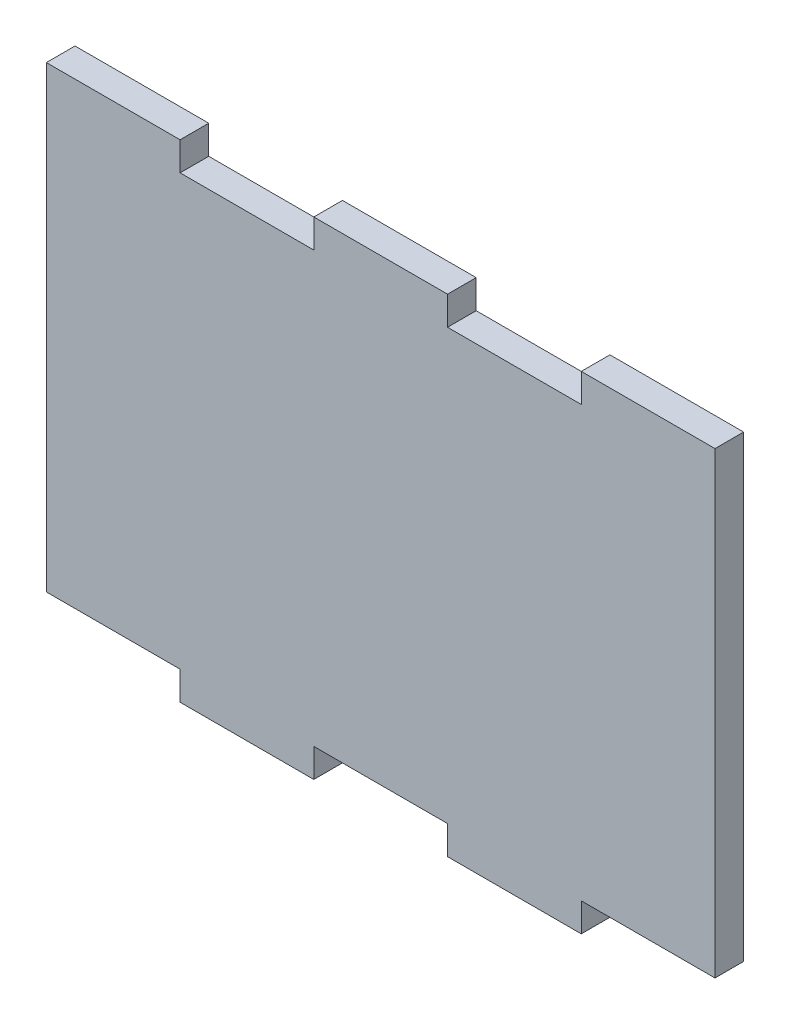
ISO-10303-21;
HEADER;
FILE_DESCRIPTION(('STEP AP214'),'2;1');
FILE_NAME('part.step','',(''),(''),'','','');
FILE_SCHEMA(('AUTOMOTIVE_DESIGN { 1 0 10303 214 1 1 1 1 }'));
ENDSEC;
DATA;
#1=APPLICATION_CONTEXT('core data for automotive mechanical design processes');
#2=APPLICATION_PROTOCOL_DEFINITION('international standard','automotive_design',2000,#1);
#3=PRODUCT_CONTEXT('',#1,'mechanical');
#4=PRODUCT('Part','Part','',(#3));
#5=PRODUCT_RELATED_PRODUCT_CATEGORY('part','',(#4));
#6=PRODUCT_DEFINITION_FORMATION('','',#4);
#7=PRODUCT_DEFINITION_CONTEXT('part definition',#1,'design');
#8=PRODUCT_DEFINITION('design','',#6,#7);
#9=PRODUCT_DEFINITION_SHAPE('','',#8);
#10=(LENGTH_UNIT() NAMED_UNIT(*) SI_UNIT(.MILLI.,.METRE.));
#11=(NAMED_UNIT(*) PLANE_ANGLE_UNIT() SI_UNIT($,.RADIAN.));
#12=(NAMED_UNIT(*) SI_UNIT($,.STERADIAN.) SOLID_ANGLE_UNIT());
#13=UNCERTAINTY_MEASURE_WITH_UNIT(LENGTH_MEASURE(1.E-05),#10,'distance_accuracy_value','');
#14=(GEOMETRIC_REPRESENTATION_CONTEXT(3) GLOBAL_UNCERTAINTY_ASSIGNED_CONTEXT((#13)) GLOBAL_UNIT_ASSIGNED_CONTEXT((#10,
#11,#12)) REPRESENTATION_CONTEXT('',''));
#15=CARTESIAN_POINT('',(0.,0.,0.));
#16=DIRECTION('',(0.,0.,1.));
#17=DIRECTION('',(1.,0.,0.));
#18=AXIS2_PLACEMENT_3D('',#15,#16,#17);
#19=CARTESIAN_POINT('',(-21.,48.,3.));
#20=DIRECTION('',(-1.,0.,0.));
#21=DIRECTION('',(0.,-1.,0.));
#22=AXIS2_PLACEMENT_3D('',#19,#20,#21);
#23=PLANE('',#22);
#24=DIRECTION('',(0.,1.,0.));
#25=VECTOR('',#24,1.);
#26=CARTESIAN_POINT('',(-21.,48.,0.));
#27=LINE('',#26,#25);
#28=CARTESIAN_POINT('',(-21.,45.,0.));
#29=VERTEX_POINT('',#28);
#30=CARTESIAN_POINT('',(-21.,48.,0.));
#31=VERTEX_POINT('',#30);
#32=EDGE_CURVE('E201',#29,#31,#27,.T.);
#33=ORIENTED_EDGE('',*,*,#32,.T.);
#34=DIRECTION('',(0.,0.,-1.));
#35=VECTOR('',#34,1.);
#36=CARTESIAN_POINT('',(-21.,48.,3.));
#37=LINE('',#36,#35);
#38=CARTESIAN_POINT('',(-21.,48.,3.));
#39=VERTEX_POINT('',#38);
#40=EDGE_CURVE('E11',#39,#31,#37,.T.);
#41=ORIENTED_EDGE('',*,*,#40,.F.);
#42=DIRECTION('',(0.,1.,0.));
#43=VECTOR('',#42,1.);
#44=CARTESIAN_POINT('',(-21.,48.,3.));
#45=LINE('',#44,#43);
#46=CARTESIAN_POINT('',(-21.,45.,3.));
#47=VERTEX_POINT('',#46);
#48=EDGE_CURVE('E239',#47,#39,#45,.T.);
#49=ORIENTED_EDGE('',*,*,#48,.F.);
#50=DIRECTION('',(0.,0.,-1.));
#51=VECTOR('',#50,1.);
#52=CARTESIAN_POINT('',(-21.,45.,3.));
#53=LINE('',#52,#51);
#54=EDGE_CURVE('E197',#47,#29,#53,.T.);
#55=ORIENTED_EDGE('',*,*,#54,.T.);
#56=EDGE_LOOP('',(#33,#41,#49,#55));
#57=FACE_BOUND('',#56,.T.);
#58=ADVANCED_FACE('F33',(#57),#23,.F.);
#59=CARTESIAN_POINT('',(-35.,48.,3.));
#60=DIRECTION('',(0.,-1.,0.));
#61=DIRECTION('',(0.,0.,-1.));
#62=AXIS2_PLACEMENT_3D('',#59,#60,#61);
#63=PLANE('',#62);
#64=DIRECTION('',(-1.,0.,0.));
#65=VECTOR('',#64,1.);
#66=CARTESIAN_POINT('',(-35.,48.,0.));
#67=LINE('',#66,#65);
#68=CARTESIAN_POINT('',(-35.,48.,0.));
#69=VERTEX_POINT('',#68);
#70=EDGE_CURVE('E204',#31,#69,#67,.T.);
#71=ORIENTED_EDGE('',*,*,#70,.T.);
#72=DIRECTION('',(0.,0.,-1.));
#73=VECTOR('',#72,1.);
#74=CARTESIAN_POINT('',(-35.,48.,3.));
#75=LINE('',#74,#73);
#76=CARTESIAN_POINT('',(-35.,48.,3.));
#77=VERTEX_POINT('',#76);
#78=EDGE_CURVE('E41',#77,#69,#75,.T.);
#79=ORIENTED_EDGE('',*,*,#78,.F.);
#80=DIRECTION('',(-1.,0.,0.));
#81=VECTOR('',#80,1.);
#82=CARTESIAN_POINT('',(-35.,48.,3.));
#83=LINE('',#82,#81);
#84=EDGE_CURVE('E128',#39,#77,#83,.T.);
#85=ORIENTED_EDGE('',*,*,#84,.F.);
#86=ORIENTED_EDGE('',*,*,#40,.T.);
#87=EDGE_LOOP('',(#71,#79,#85,#86));
#88=FACE_BOUND('',#87,.T.);
#89=ADVANCED_FACE('F357',(#88),#63,.F.);
#90=CARTESIAN_POINT('',(-35.,0.,3.));
#91=DIRECTION('',(1.,0.,0.));
#92=DIRECTION('',(0.,0.,-1.));
#93=AXIS2_PLACEMENT_3D('',#90,#91,#92);
#94=PLANE('',#93);
#95=DIRECTION('',(0.,-1.,0.));
#96=VECTOR('',#95,1.);
#97=CARTESIAN_POINT('',(-35.,0.,0.));
#98=LINE('',#97,#96);
#99=CARTESIAN_POINT('',(-35.,0.,0.));
#100=VERTEX_POINT('',#99);
#101=EDGE_CURVE('E206',#69,#100,#98,.T.);
#102=ORIENTED_EDGE('',*,*,#101,.T.);
#103=DIRECTION('',(0.,0.,-1.));
#104=VECTOR('',#103,1.);
#105=CARTESIAN_POINT('',(-35.,0.,3.));
#106=LINE('',#105,#104);
#107=CARTESIAN_POINT('',(-35.,0.,3.));
#108=VERTEX_POINT('',#107);
#109=EDGE_CURVE('E282',#108,#100,#106,.T.);
#110=ORIENTED_EDGE('',*,*,#109,.F.);
#111=DIRECTION('',(0.,-1.,0.));
#112=VECTOR('',#111,1.);
#113=CARTESIAN_POINT('',(-35.,0.,3.));
#114=LINE('',#113,#112);
#115=EDGE_CURVE('E290',#77,#108,#114,.T.);
#116=ORIENTED_EDGE('',*,*,#115,.F.);
#117=ORIENTED_EDGE('',*,*,#78,.T.);
#118=EDGE_LOOP('',(#102,#110,#116,#117));
#119=FACE_BOUND('',#118,.T.);
#120=ADVANCED_FACE('F288',(#119),#94,.F.);
#121=CARTESIAN_POINT('',(-21.,0.,3.));
#122=DIRECTION('',(0.,1.,0.));
#123=DIRECTION('',(-1.,0.,0.));
#124=AXIS2_PLACEMENT_3D('',#121,#122,#123);
#125=PLANE('',#124);
#126=DIRECTION('',(1.,0.,0.));
#127=VECTOR('',#126,1.);
#128=CARTESIAN_POINT('',(-21.,0.,0.));
#129=LINE('',#128,#127);
#130=CARTESIAN_POINT('',(-21.,0.,0.));
#131=VERTEX_POINT('',#130);
#132=EDGE_CURVE('E208',#100,#131,#129,.T.);
#133=ORIENTED_EDGE('',*,*,#132,.T.);
#134=DIRECTION('',(0.,0.,-1.));
#135=VECTOR('',#134,1.);
#136=CARTESIAN_POINT('',(-21.,0.,3.));
#137=LINE('',#136,#135);
#138=CARTESIAN_POINT('',(-21.,0.,3.));
#139=VERTEX_POINT('',#138);
#140=EDGE_CURVE('E279',#139,#131,#137,.T.);
#141=ORIENTED_EDGE('',*,*,#140,.F.);
#142=DIRECTION('',(1.,0.,0.));
#143=VECTOR('',#142,1.);
#144=CARTESIAN_POINT('',(-21.,0.,3.));
#145=LINE('',#144,#143);
#146=EDGE_CURVE('E308',#108,#139,#145,.T.);
#147=ORIENTED_EDGE('',*,*,#146,.F.);
#148=ORIENTED_EDGE('',*,*,#109,.T.);
#149=EDGE_LOOP('',(#133,#141,#147,#148));
#150=FACE_BOUND('',#149,.T.);
#151=ADVANCED_FACE('F299',(#150),#125,.F.);
#152=CARTESIAN_POINT('',(-21.,-3.,3.));
#153=DIRECTION('',(1.,0.,0.));
#154=DIRECTION('',(0.,0.,-1.));
#155=AXIS2_PLACEMENT_3D('',#152,#153,#154);
#156=PLANE('',#155);
#157=DIRECTION('',(0.,-1.,0.));
#158=VECTOR('',#157,1.);
#159=CARTESIAN_POINT('',(-21.,-3.,0.));
#160=LINE('',#159,#158);
#161=CARTESIAN_POINT('',(-21.,-3.,0.));
#162=VERTEX_POINT('',#161);
#163=EDGE_CURVE('E210',#131,#162,#160,.T.);
#164=ORIENTED_EDGE('',*,*,#163,.T.);
#165=DIRECTION('',(0.,0.,-1.));
#166=VECTOR('',#165,1.);
#167=CARTESIAN_POINT('',(-21.,-3.,3.));
#168=LINE('',#167,#166);
#169=CARTESIAN_POINT('',(-21.,-3.,3.));
#170=VERTEX_POINT('',#169);
#171=EDGE_CURVE('E276',#170,#162,#168,.T.);
#172=ORIENTED_EDGE('',*,*,#171,.F.);
#173=DIRECTION('',(0.,-1.,0.));
#174=VECTOR('',#173,1.);
#175=CARTESIAN_POINT('',(-21.,-3.,3.));
#176=LINE('',#175,#174);
#177=EDGE_CURVE('E305',#139,#170,#176,.T.);
#178=ORIENTED_EDGE('',*,*,#177,.F.);
#179=ORIENTED_EDGE('',*,*,#140,.T.);
#180=EDGE_LOOP('',(#164,#172,#178,#179));
#181=FACE_BOUND('',#180,.T.);
#182=ADVANCED_FACE('F303',(#181),#156,.F.);
#183=CARTESIAN_POINT('',(-21.,-3.,3.));
#184=DIRECTION('',(0.,1.,0.));
#185=DIRECTION('',(-1.,0.,0.));
#186=AXIS2_PLACEMENT_3D('',#183,#184,#185);
#187=PLANE('',#186);
#188=DIRECTION('',(1.,0.,0.));
#189=VECTOR('',#188,1.);
#190=CARTESIAN_POINT('',(-21.,-3.,0.));
#191=LINE('',#190,#189);
#192=CARTESIAN_POINT('',(-7.,-3.,0.));
#193=VERTEX_POINT('',#192);
#194=EDGE_CURVE('E212',#162,#193,#191,.T.);
#195=ORIENTED_EDGE('',*,*,#194,.T.);
#196=DIRECTION('',(0.,0.,-1.));
#197=VECTOR('',#196,1.);
#198=CARTESIAN_POINT('',(-7.,-3.,3.));
#199=LINE('',#198,#197);
#200=CARTESIAN_POINT('',(-7.,-3.,3.));
#201=VERTEX_POINT('',#200);
#202=EDGE_CURVE('E273',#201,#193,#199,.T.);
#203=ORIENTED_EDGE('',*,*,#202,.F.);
#204=DIRECTION('',(1.,0.,0.));
#205=VECTOR('',#204,1.);
#206=CARTESIAN_POINT('',(-21.,-3.,3.));
#207=LINE('',#206,#205);
#208=EDGE_CURVE('E307',#170,#201,#207,.T.);
#209=ORIENTED_EDGE('',*,*,#208,.F.);
#210=ORIENTED_EDGE('',*,*,#171,.T.);
#211=EDGE_LOOP('',(#195,#203,#209,#210));
#212=FACE_BOUND('',#211,.T.);
#213=ADVANCED_FACE('F370',(#212),#187,.F.);
#214=CARTESIAN_POINT('',(-7.,0.,3.));
#215=DIRECTION('',(-1.,0.,0.));
#216=DIRECTION('',(0.,0.,1.));
#217=AXIS2_PLACEMENT_3D('',#214,#215,#216);
#218=PLANE('',#217);
#219=DIRECTION('',(0.,1.,0.));
#220=VECTOR('',#219,1.);
#221=CARTESIAN_POINT('',(-7.,0.,0.));
#222=LINE('',#221,#220);
#223=CARTESIAN_POINT('',(-7.,0.,0.));
#224=VERTEX_POINT('',#223);
#225=EDGE_CURVE('E214',#193,#224,#222,.T.);
#226=ORIENTED_EDGE('',*,*,#225,.T.);
#227=DIRECTION('',(0.,0.,-1.));
#228=VECTOR('',#227,1.);
#229=CARTESIAN_POINT('',(-7.,0.,3.));
#230=LINE('',#229,#228);
#231=CARTESIAN_POINT('',(-7.,0.,3.));
#232=VERTEX_POINT('',#231);
#233=EDGE_CURVE('E270',#232,#224,#230,.T.);
#234=ORIENTED_EDGE('',*,*,#233,.F.);
#235=DIRECTION('',(0.,1.,0.));
#236=VECTOR('',#235,1.);
#237=CARTESIAN_POINT('',(-7.,0.,3.));
#238=LINE('',#237,#236);
#239=EDGE_CURVE('E310',#201,#232,#238,.T.);
#240=ORIENTED_EDGE('',*,*,#239,.F.);
#241=ORIENTED_EDGE('',*,*,#202,.T.);
#242=EDGE_LOOP('',(#226,#234,#240,#241));
#243=FACE_BOUND('',#242,.T.);
#244=ADVANCED_FACE('F373',(#243),#218,.F.);
#245=CARTESIAN_POINT('',(-7.,0.,3.));
#246=DIRECTION('',(0.,1.,0.));
#247=DIRECTION('',(-1.,0.,0.));
#248=AXIS2_PLACEMENT_3D('',#245,#246,#247);
#249=PLANE('',#248);
#250=DIRECTION('',(1.,0.,0.));
#251=VECTOR('',#250,1.);
#252=CARTESIAN_POINT('',(-7.,0.,0.));
#253=LINE('',#252,#251);
#254=CARTESIAN_POINT('',(7.,0.,0.));
#255=VERTEX_POINT('',#254);
#256=EDGE_CURVE('E216',#224,#255,#253,.T.);
#257=ORIENTED_EDGE('',*,*,#256,.T.);
#258=DIRECTION('',(0.,0.,-1.));
#259=VECTOR('',#258,1.);
#260=CARTESIAN_POINT('',(7.,0.,3.));
#261=LINE('',#260,#259);
#262=CARTESIAN_POINT('',(7.,0.,3.));
#263=VERTEX_POINT('',#262);
#264=EDGE_CURVE('E267',#263,#255,#261,.T.);
#265=ORIENTED_EDGE('',*,*,#264,.F.);
#266=DIRECTION('',(1.,0.,0.));
#267=VECTOR('',#266,1.);
#268=CARTESIAN_POINT('',(-7.,0.,3.));
#269=LINE('',#268,#267);
#270=EDGE_CURVE('E316',#232,#263,#269,.T.);
#271=ORIENTED_EDGE('',*,*,#270,.F.);
#272=ORIENTED_EDGE('',*,*,#233,.T.);
#273=EDGE_LOOP('',(#257,#265,#271,#272));
#274=FACE_BOUND('',#273,.T.);
#275=ADVANCED_FACE('F377',(#274),#249,.F.);
#276=CARTESIAN_POINT('',(7.,0.,3.));
#277=DIRECTION('',(1.,0.,0.));
#278=DIRECTION('',(0.,0.,-1.));
#279=AXIS2_PLACEMENT_3D('',#276,#277,#278);
#280=PLANE('',#279);
#281=DIRECTION('',(0.,-1.,0.));
#282=VECTOR('',#281,1.);
#283=CARTESIAN_POINT('',(7.,0.,0.));
#284=LINE('',#283,#282);
#285=CARTESIAN_POINT('',(7.,-3.,0.));
#286=VERTEX_POINT('',#285);
#287=EDGE_CURVE('E218',#255,#286,#284,.T.);
#288=ORIENTED_EDGE('',*,*,#287,.T.);
#289=DIRECTION('',(0.,0.,-1.));
#290=VECTOR('',#289,1.);
#291=CARTESIAN_POINT('',(7.,-3.,3.));
#292=LINE('',#291,#290);
#293=CARTESIAN_POINT('',(7.,-3.,3.));
#294=VERTEX_POINT('',#293);
#295=EDGE_CURVE('E264',#294,#286,#292,.T.);
#296=ORIENTED_EDGE('',*,*,#295,.F.);
#297=DIRECTION('',(0.,-1.,0.));
#298=VECTOR('',#297,1.);
#299=CARTESIAN_POINT('',(7.,0.,3.));
#300=LINE('',#299,#298);
#301=EDGE_CURVE('E318',#263,#294,#300,.T.);
#302=ORIENTED_EDGE('',*,*,#301,.F.);
#303=ORIENTED_EDGE('',*,*,#264,.T.);
#304=EDGE_LOOP('',(#288,#296,#302,#303));
#305=FACE_BOUND('',#304,.T.);
#306=ADVANCED_FACE('F381',(#305),#280,.F.);
#307=CARTESIAN_POINT('',(7.,-3.,3.));
#308=DIRECTION('',(0.,1.,0.));
#309=DIRECTION('',(0.,0.,1.));
#310=AXIS2_PLACEMENT_3D('',#307,#308,#309);
#311=PLANE('',#310);
#312=DIRECTION('',(1.,0.,0.));
#313=VECTOR('',#312,1.);
#314=CARTESIAN_POINT('',(7.,-3.,0.));
#315=LINE('',#314,#313);
#316=CARTESIAN_POINT('',(21.,-3.,0.));
#317=VERTEX_POINT('',#316);
#318=EDGE_CURVE('E220',#286,#317,#315,.T.);
#319=ORIENTED_EDGE('',*,*,#318,.T.);
#320=DIRECTION('',(0.,0.,-1.));
#321=VECTOR('',#320,1.);
#322=CARTESIAN_POINT('',(21.,-3.,3.));
#323=LINE('',#322,#321);
#324=CARTESIAN_POINT('',(21.,-3.,3.));
#325=VERTEX_POINT('',#324);
#326=EDGE_CURVE('E261',#325,#317,#323,.T.);
#327=ORIENTED_EDGE('',*,*,#326,.F.);
#328=DIRECTION('',(1.,0.,0.));
#329=VECTOR('',#328,1.);
#330=CARTESIAN_POINT('',(7.,-3.,3.));
#331=LINE('',#330,#329);
#332=EDGE_CURVE('E320',#294,#325,#331,.T.);
#333=ORIENTED_EDGE('',*,*,#332,.F.);
#334=ORIENTED_EDGE('',*,*,#295,.T.);
#335=EDGE_LOOP('',(#319,#327,#333,#334));
#336=FACE_BOUND('',#335,.T.);
#337=ADVANCED_FACE('F385',(#336),#311,.F.);
#338=CARTESIAN_POINT('',(21.,-3.,3.));
#339=DIRECTION('',(-1.,0.,0.));
#340=DIRECTION('',(0.,0.,1.));
#341=AXIS2_PLACEMENT_3D('',#338,#339,#340);
#342=PLANE('',#341);
#343=DIRECTION('',(0.,1.,0.));
#344=VECTOR('',#343,1.);
#345=CARTESIAN_POINT('',(21.,-3.,0.));
#346=LINE('',#345,#344);
#347=CARTESIAN_POINT('',(21.,0.,0.));
#348=VERTEX_POINT('',#347);
#349=EDGE_CURVE('E222',#317,#348,#346,.T.);
#350=ORIENTED_EDGE('',*,*,#349,.T.);
#351=DIRECTION('',(0.,0.,-1.));
#352=VECTOR('',#351,1.);
#353=CARTESIAN_POINT('',(21.,0.,3.));
#354=LINE('',#353,#352);
#355=CARTESIAN_POINT('',(21.,0.,3.));
#356=VERTEX_POINT('',#355);
#357=EDGE_CURVE('E258',#356,#348,#354,.T.);
#358=ORIENTED_EDGE('',*,*,#357,.F.);
#359=DIRECTION('',(0.,1.,0.));
#360=VECTOR('',#359,1.);
#361=CARTESIAN_POINT('',(21.,-3.,3.));
#362=LINE('',#361,#360);
#363=EDGE_CURVE('E322',#325,#356,#362,.T.);
#364=ORIENTED_EDGE('',*,*,#363,.F.);
#365=ORIENTED_EDGE('',*,*,#326,.T.);
#366=EDGE_LOOP('',(#350,#358,#364,#365));
#367=FACE_BOUND('',#366,.T.);
#368=ADVANCED_FACE('F389',(#367),#342,.F.);
#369=CARTESIAN_POINT('',(21.,0.,3.));
#370=DIRECTION('',(0.,1.,0.));
#371=DIRECTION('',(0.,0.,1.));
#372=AXIS2_PLACEMENT_3D('',#369,#370,#371);
#373=PLANE('',#372);
#374=DIRECTION('',(1.,0.,0.));
#375=VECTOR('',#374,1.);
#376=CARTESIAN_POINT('',(21.,0.,0.));
#377=LINE('',#376,#375);
#378=CARTESIAN_POINT('',(35.,0.,0.));
#379=VERTEX_POINT('',#378);
#380=EDGE_CURVE('E224',#348,#379,#377,.T.);
#381=ORIENTED_EDGE('',*,*,#380,.T.);
#382=DIRECTION('',(0.,0.,-1.));
#383=VECTOR('',#382,1.);
#384=CARTESIAN_POINT('',(35.,0.,3.));
#385=LINE('',#384,#383);
#386=CARTESIAN_POINT('',(35.,0.,3.));
#387=VERTEX_POINT('',#386);
#388=EDGE_CURVE('E255',#387,#379,#385,.T.);
#389=ORIENTED_EDGE('',*,*,#388,.F.);
#390=DIRECTION('',(1.,0.,0.));
#391=VECTOR('',#390,1.);
#392=CARTESIAN_POINT('',(21.,0.,3.));
#393=LINE('',#392,#391);
#394=EDGE_CURVE('E324',#356,#387,#393,.T.);
#395=ORIENTED_EDGE('',*,*,#394,.F.);
#396=ORIENTED_EDGE('',*,*,#357,.T.);
#397=EDGE_LOOP('',(#381,#389,#395,#396));
#398=FACE_BOUND('',#397,.T.);
#399=ADVANCED_FACE('F393',(#398),#373,.F.);
#400=CARTESIAN_POINT('',(35.,0.,3.));
#401=DIRECTION('',(-1.,0.,0.));
#402=DIRECTION('',(0.,0.,1.));
#403=AXIS2_PLACEMENT_3D('',#400,#401,#402);
#404=PLANE('',#403);
#405=DIRECTION('',(0.,1.,0.));
#406=VECTOR('',#405,1.);
#407=CARTESIAN_POINT('',(35.,0.,0.));
#408=LINE('',#407,#406);
#409=CARTESIAN_POINT('',(35.,48.,0.));
#410=VERTEX_POINT('',#409);
#411=EDGE_CURVE('E226',#379,#410,#408,.T.);
#412=ORIENTED_EDGE('',*,*,#411,.T.);
#413=DIRECTION('',(0.,0.,-1.));
#414=VECTOR('',#413,1.);
#415=CARTESIAN_POINT('',(35.,48.,3.));
#416=LINE('',#415,#414);
#417=CARTESIAN_POINT('',(35.,48.,3.));
#418=VERTEX_POINT('',#417);
#419=EDGE_CURVE('E252',#418,#410,#416,.T.);
#420=ORIENTED_EDGE('',*,*,#419,.F.);
#421=DIRECTION('',(0.,1.,0.));
#422=VECTOR('',#421,1.);
#423=CARTESIAN_POINT('',(35.,0.,3.));
#424=LINE('',#423,#422);
#425=EDGE_CURVE('E326',#387,#418,#424,.T.);
#426=ORIENTED_EDGE('',*,*,#425,.F.);
#427=ORIENTED_EDGE('',*,*,#388,.T.);
#428=EDGE_LOOP('',(#412,#420,#426,#427));
#429=FACE_BOUND('',#428,.T.);
#430=ADVANCED_FACE('F397',(#429),#404,.F.);
#431=CARTESIAN_POINT('',(35.,48.,3.));
#432=DIRECTION('',(0.,-1.,0.));
#433=DIRECTION('',(0.,0.,-1.));
#434=AXIS2_PLACEMENT_3D('',#431,#432,#433);
#435=PLANE('',#434);
#436=DIRECTION('',(-1.,0.,0.));
#437=VECTOR('',#436,1.);
#438=CARTESIAN_POINT('',(35.,48.,0.));
#439=LINE('',#438,#437);
#440=CARTESIAN_POINT('',(21.,48.,0.));
#441=VERTEX_POINT('',#440);
#442=EDGE_CURVE('E228',#410,#441,#439,.T.);
#443=ORIENTED_EDGE('',*,*,#442,.T.);
#444=DIRECTION('',(0.,0.,-1.));
#445=VECTOR('',#444,1.);
#446=CARTESIAN_POINT('',(21.,48.,3.));
#447=LINE('',#446,#445);
#448=CARTESIAN_POINT('',(21.,48.,3.));
#449=VERTEX_POINT('',#448);
#450=EDGE_CURVE('E249',#449,#441,#447,.T.);
#451=ORIENTED_EDGE('',*,*,#450,.F.);
#452=DIRECTION('',(-1.,0.,0.));
#453=VECTOR('',#452,1.);
#454=CARTESIAN_POINT('',(35.,48.,3.));
#455=LINE('',#454,#453);
#456=EDGE_CURVE('E328',#418,#449,#455,.T.);
#457=ORIENTED_EDGE('',*,*,#456,.F.);
#458=ORIENTED_EDGE('',*,*,#419,.T.);
#459=EDGE_LOOP('',(#443,#451,#457,#458));
#460=FACE_BOUND('',#459,.T.);
#461=ADVANCED_FACE('F401',(#460),#435,.F.);
#462=CARTESIAN_POINT('',(21.,48.,3.));
#463=DIRECTION('',(1.,0.,0.));
#464=DIRECTION('',(0.,1.,0.));
#465=AXIS2_PLACEMENT_3D('',#462,#463,#464);
#466=PLANE('',#465);
#467=DIRECTION('',(0.,-1.,0.));
#468=VECTOR('',#467,1.);
#469=CARTESIAN_POINT('',(21.,48.,0.));
#470=LINE('',#469,#468);
#471=CARTESIAN_POINT('',(21.,45.,0.));
#472=VERTEX_POINT('',#471);
#473=EDGE_CURVE('E230',#441,#472,#470,.T.);
#474=ORIENTED_EDGE('',*,*,#473,.T.);
#475=DIRECTION('',(0.,0.,-1.));
#476=VECTOR('',#475,1.);
#477=CARTESIAN_POINT('',(21.,45.,3.));
#478=LINE('',#477,#476);
#479=CARTESIAN_POINT('',(21.,45.,3.));
#480=VERTEX_POINT('',#479);
#481=EDGE_CURVE('E246',#480,#472,#478,.T.);
#482=ORIENTED_EDGE('',*,*,#481,.F.);
#483=DIRECTION('',(0.,-1.,0.));
#484=VECTOR('',#483,1.);
#485=CARTESIAN_POINT('',(21.,48.,3.));
#486=LINE('',#485,#484);
#487=EDGE_CURVE('E330',#449,#480,#486,.T.);
#488=ORIENTED_EDGE('',*,*,#487,.F.);
#489=ORIENTED_EDGE('',*,*,#450,.T.);
#490=EDGE_LOOP('',(#474,#482,#488,#489));
#491=FACE_BOUND('',#490,.T.);
#492=ADVANCED_FACE('F405',(#491),#466,.F.);
#493=CARTESIAN_POINT('',(7.,45.,3.));
#494=DIRECTION('',(0.,-1.,0.));
#495=DIRECTION('',(1.,0.,0.));
#496=AXIS2_PLACEMENT_3D('',#493,#494,#495);
#497=PLANE('',#496);
#498=DIRECTION('',(-1.,0.,0.));
#499=VECTOR('',#498,1.);
#500=CARTESIAN_POINT('',(7.,45.,0.));
#501=LINE('',#500,#499);
#502=CARTESIAN_POINT('',(7.,45.,0.));
#503=VERTEX_POINT('',#502);
#504=EDGE_CURVE('E232',#472,#503,#501,.T.);
#505=ORIENTED_EDGE('',*,*,#504,.T.);
#506=DIRECTION('',(0.,0.,-1.));
#507=VECTOR('',#506,1.);
#508=CARTESIAN_POINT('',(7.,45.,3.));
#509=LINE('',#508,#507);
#510=CARTESIAN_POINT('',(7.,45.,3.));
#511=VERTEX_POINT('',#510);
#512=EDGE_CURVE('E243',#511,#503,#509,.T.);
#513=ORIENTED_EDGE('',*,*,#512,.F.);
#514=DIRECTION('',(-1.,0.,0.));
#515=VECTOR('',#514,1.);
#516=CARTESIAN_POINT('',(7.,45.,3.));
#517=LINE('',#516,#515);
#518=EDGE_CURVE('E332',#480,#511,#517,.T.);
#519=ORIENTED_EDGE('',*,*,#518,.F.);
#520=ORIENTED_EDGE('',*,*,#481,.T.);
#521=EDGE_LOOP('',(#505,#513,#519,#520));
#522=FACE_BOUND('',#521,.T.);
#523=ADVANCED_FACE('F338',(#522),#497,.F.);
#524=CARTESIAN_POINT('',(7.,45.,3.));
#525=DIRECTION('',(-1.,0.,0.));
#526=DIRECTION('',(0.,0.,1.));
#527=AXIS2_PLACEMENT_3D('',#524,#525,#526);
#528=PLANE('',#527);
#529=DIRECTION('',(0.,1.,0.));
#530=VECTOR('',#529,1.);
#531=CARTESIAN_POINT('',(7.,45.,0.));
#532=LINE('',#531,#530);
#533=CARTESIAN_POINT('',(7.,48.,0.));
#534=VERTEX_POINT('',#533);
#535=EDGE_CURVE('E234',#503,#534,#532,.T.);
#536=ORIENTED_EDGE('',*,*,#535,.T.);
#537=DIRECTION('',(0.,0.,-1.));
#538=VECTOR('',#537,1.);
#539=CARTESIAN_POINT('',(7.,48.,3.));
#540=LINE('',#539,#538);
#541=CARTESIAN_POINT('',(7.,48.,3.));
#542=VERTEX_POINT('',#541);
#543=EDGE_CURVE('E192',#542,#534,#540,.T.);
#544=ORIENTED_EDGE('',*,*,#543,.F.);
#545=DIRECTION('',(0.,1.,0.));
#546=VECTOR('',#545,1.);
#547=CARTESIAN_POINT('',(7.,45.,3.));
#548=LINE('',#547,#546);
#549=EDGE_CURVE('E183',#511,#542,#548,.T.);
#550=ORIENTED_EDGE('',*,*,#549,.F.);
#551=ORIENTED_EDGE('',*,*,#512,.T.);
#552=EDGE_LOOP('',(#536,#544,#550,#551));
#553=FACE_BOUND('',#552,.T.);
#554=ADVANCED_FACE('F342',(#553),#528,.F.);
#555=CARTESIAN_POINT('',(7.,48.,3.));
#556=DIRECTION('',(0.,-1.,0.));
#557=DIRECTION('',(0.,0.,-1.));
#558=AXIS2_PLACEMENT_3D('',#555,#556,#557);
#559=PLANE('',#558);
#560=DIRECTION('',(-1.,0.,0.));
#561=VECTOR('',#560,1.);
#562=CARTESIAN_POINT('',(7.,48.,0.));
#563=LINE('',#562,#561);
#564=CARTESIAN_POINT('',(-7.,48.,0.));
#565=VERTEX_POINT('',#564);
#566=EDGE_CURVE('E191',#534,#565,#563,.T.);
#567=ORIENTED_EDGE('',*,*,#566,.T.);
#568=DIRECTION('',(0.,0.,-1.));
#569=VECTOR('',#568,1.);
#570=CARTESIAN_POINT('',(-7.,48.,3.));
#571=LINE('',#570,#569);
#572=CARTESIAN_POINT('',(-7.,48.,3.));
#573=VERTEX_POINT('',#572);
#574=EDGE_CURVE('E188',#573,#565,#571,.T.);
#575=ORIENTED_EDGE('',*,*,#574,.F.);
#576=DIRECTION('',(-1.,0.,0.));
#577=VECTOR('',#576,1.);
#578=CARTESIAN_POINT('',(7.,48.,3.));
#579=LINE('',#578,#577);
#580=EDGE_CURVE('E177',#542,#573,#579,.T.);
#581=ORIENTED_EDGE('',*,*,#580,.F.);
#582=ORIENTED_EDGE('',*,*,#543,.T.);
#583=EDGE_LOOP('',(#567,#575,#581,#582));
#584=FACE_BOUND('',#583,.T.);
#585=ADVANCED_FACE('F189',(#584),#559,.F.);
#586=CARTESIAN_POINT('',(-7.,45.,3.));
#587=DIRECTION('',(1.,0.,0.));
#588=DIRECTION('',(0.,0.,-1.));
#589=AXIS2_PLACEMENT_3D('',#586,#587,#588);
#590=PLANE('',#589);
#591=DIRECTION('',(0.,-1.,0.));
#592=VECTOR('',#591,1.);
#593=CARTESIAN_POINT('',(-7.,45.,0.));
#594=LINE('',#593,#592);
#595=CARTESIAN_POINT('',(-7.,45.,0.));
#596=VERTEX_POINT('',#595);
#597=EDGE_CURVE('E114',#565,#596,#594,.T.);
#598=ORIENTED_EDGE('',*,*,#597,.T.);
#599=DIRECTION('',(0.,0.,-1.));
#600=VECTOR('',#599,1.);
#601=CARTESIAN_POINT('',(-7.,45.,3.));
#602=LINE('',#601,#600);
#603=CARTESIAN_POINT('',(-7.,45.,3.));
#604=VERTEX_POINT('',#603);
#605=EDGE_CURVE('E193',#604,#596,#602,.T.);
#606=ORIENTED_EDGE('',*,*,#605,.F.);
#607=DIRECTION('',(0.,-1.,0.));
#608=VECTOR('',#607,1.);
#609=CARTESIAN_POINT('',(-7.,45.,3.));
#610=LINE('',#609,#608);
#611=EDGE_CURVE('E181',#573,#604,#610,.T.);
#612=ORIENTED_EDGE('',*,*,#611,.F.);
#613=ORIENTED_EDGE('',*,*,#574,.T.);
#614=EDGE_LOOP('',(#598,#606,#612,#613));
#615=FACE_BOUND('',#614,.T.);
#616=ADVANCED_FACE('F195',(#615),#590,.F.);
#617=CARTESIAN_POINT('',(-21.,45.,3.));
#618=DIRECTION('',(0.,-1.,0.));
#619=DIRECTION('',(1.,0.,0.));
#620=AXIS2_PLACEMENT_3D('',#617,#618,#619);
#621=PLANE('',#620);
#622=DIRECTION('',(-1.,0.,0.));
#623=VECTOR('',#622,1.);
#624=CARTESIAN_POINT('',(-21.,45.,0.));
#625=LINE('',#624,#623);
#626=EDGE_CURVE('E120',#596,#29,#625,.T.);
#627=ORIENTED_EDGE('',*,*,#626,.T.);
#628=ORIENTED_EDGE('',*,*,#54,.F.);
#629=DIRECTION('',(-1.,0.,0.));
#630=VECTOR('',#629,1.);
#631=CARTESIAN_POINT('',(-21.,45.,3.));
#632=LINE('',#631,#630);
#633=EDGE_CURVE('E49',#604,#47,#632,.T.);
#634=ORIENTED_EDGE('',*,*,#633,.F.);
#635=ORIENTED_EDGE('',*,*,#605,.T.);
#636=EDGE_LOOP('',(#627,#628,#634,#635));
#637=FACE_BOUND('',#636,.T.);
#638=ADVANCED_FACE('F346',(#637),#621,.F.);
#639=CARTESIAN_POINT('',(0.,0.,3.));
#640=DIRECTION('',(0.,0.,1.));
#641=DIRECTION('',(1.,0.,0.));
#642=AXIS2_PLACEMENT_3D('',#639,#640,#641);
#643=PLANE('',#642);
#644=ORIENTED_EDGE('',*,*,#48,.T.);
#645=ORIENTED_EDGE('',*,*,#84,.T.);
#646=ORIENTED_EDGE('',*,*,#115,.T.);
#647=ORIENTED_EDGE('',*,*,#146,.T.);
#648=ORIENTED_EDGE('',*,*,#177,.T.);
#649=ORIENTED_EDGE('',*,*,#208,.T.);
#650=ORIENTED_EDGE('',*,*,#239,.T.);
#651=ORIENTED_EDGE('',*,*,#270,.T.);
#652=ORIENTED_EDGE('',*,*,#301,.T.);
#653=ORIENTED_EDGE('',*,*,#332,.T.);
#654=ORIENTED_EDGE('',*,*,#363,.T.);
#655=ORIENTED_EDGE('',*,*,#394,.T.);
#656=ORIENTED_EDGE('',*,*,#425,.T.);
#657=ORIENTED_EDGE('',*,*,#456,.T.);
#658=ORIENTED_EDGE('',*,*,#487,.T.);
#659=ORIENTED_EDGE('',*,*,#518,.T.);
#660=ORIENTED_EDGE('',*,*,#549,.T.);
#661=ORIENTED_EDGE('',*,*,#580,.T.);
#662=ORIENTED_EDGE('',*,*,#611,.T.);
#663=ORIENTED_EDGE('',*,*,#633,.T.);
#664=EDGE_LOOP('',(#644,#645,#646,#647,#648,#649,#650,#651,#652,#653,#654,#655,#656,#657,#658,
#659,#660,#661,#662,#663));
#665=FACE_BOUND('',#664,.T.);
#666=ADVANCED_FACE('F179',(#665),#643,.T.);
#667=CARTESIAN_POINT('',(0.,0.,0.));
#668=DIRECTION('',(0.,0.,1.));
#669=DIRECTION('',(1.,0.,0.));
#670=AXIS2_PLACEMENT_3D('',#667,#668,#669);
#671=PLANE('',#670);
#672=ORIENTED_EDGE('',*,*,#32,.F.);
#673=ORIENTED_EDGE('',*,*,#626,.F.);
#674=ORIENTED_EDGE('',*,*,#597,.F.);
#675=ORIENTED_EDGE('',*,*,#566,.F.);
#676=ORIENTED_EDGE('',*,*,#535,.F.);
#677=ORIENTED_EDGE('',*,*,#504,.F.);
#678=ORIENTED_EDGE('',*,*,#473,.F.);
#679=ORIENTED_EDGE('',*,*,#442,.F.);
#680=ORIENTED_EDGE('',*,*,#411,.F.);
#681=ORIENTED_EDGE('',*,*,#380,.F.);
#682=ORIENTED_EDGE('',*,*,#349,.F.);
#683=ORIENTED_EDGE('',*,*,#318,.F.);
#684=ORIENTED_EDGE('',*,*,#287,.F.);
#685=ORIENTED_EDGE('',*,*,#256,.F.);
#686=ORIENTED_EDGE('',*,*,#225,.F.);
#687=ORIENTED_EDGE('',*,*,#194,.F.);
#688=ORIENTED_EDGE('',*,*,#163,.F.);
#689=ORIENTED_EDGE('',*,*,#132,.F.);
#690=ORIENTED_EDGE('',*,*,#101,.F.);
#691=ORIENTED_EDGE('',*,*,#70,.F.);
#692=EDGE_LOOP('',(#672,#673,#674,#675,#676,#677,#678,#679,#680,#681,#682,#683,#684,#685,#686,
#687,#688,#689,#690,#691));
#693=FACE_BOUND('',#692,.T.);
#694=ADVANCED_FACE('F294',(#693),#671,.F.);
#695=CLOSED_SHELL('',(#58,#89,#120,#151,#182,#213,#244,#275,#306,#337,#368,#399,#430,#461,#492,
#523,#554,#585,#616,#638,#666,#694));
#696=MANIFOLD_SOLID_BREP('B2',#695);
#697=ADVANCED_BREP_SHAPE_REPRESENTATION('',(#18,#696),#14);
#698=SHAPE_DEFINITION_REPRESENTATION(#9,#697);
ENDSEC;
END-ISO-10303-21;
